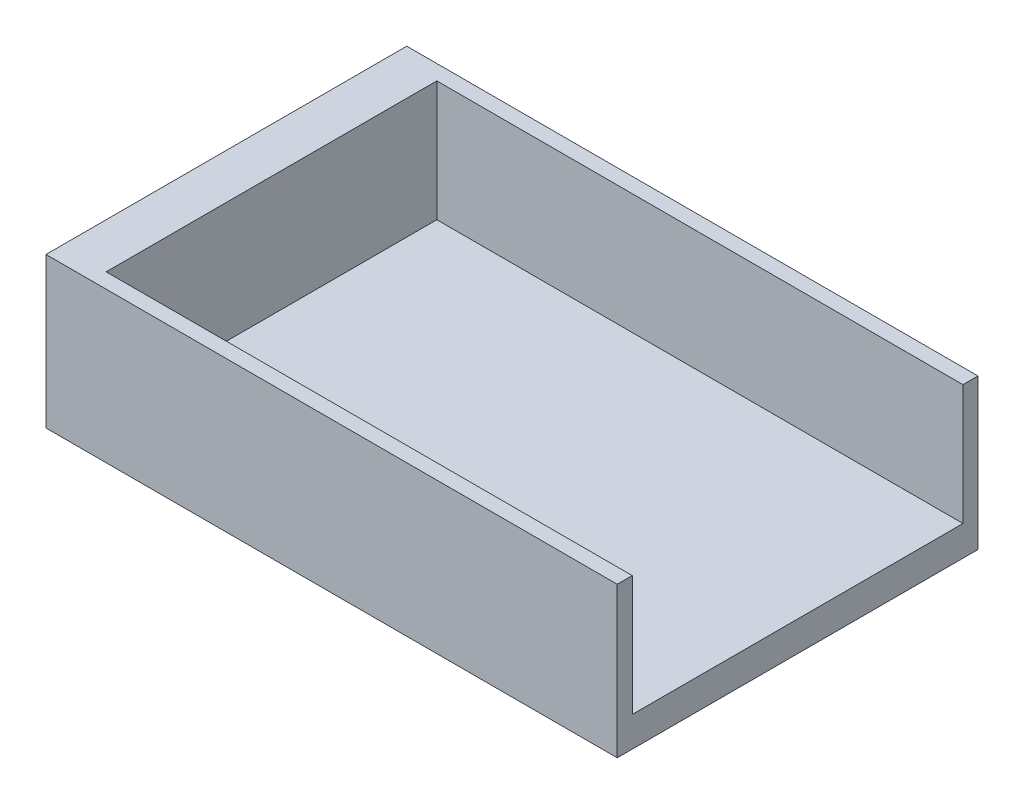
ISO-10303-21;
HEADER;
FILE_DESCRIPTION(('STEP AP214'),'2;1');
FILE_NAME('part.step','',(''),(''),'','','');
FILE_SCHEMA(('AUTOMOTIVE_DESIGN { 1 0 10303 214 1 1 1 1 }'));
ENDSEC;
DATA;
#1=APPLICATION_CONTEXT('core data for automotive mechanical design processes');
#2=APPLICATION_PROTOCOL_DEFINITION('international standard','automotive_design',2000,#1);
#3=PRODUCT_CONTEXT('',#1,'mechanical');
#4=PRODUCT('Part','Part','',(#3));
#5=PRODUCT_RELATED_PRODUCT_CATEGORY('part','',(#4));
#6=PRODUCT_DEFINITION_FORMATION('','',#4);
#7=PRODUCT_DEFINITION_CONTEXT('part definition',#1,'design');
#8=PRODUCT_DEFINITION('design','',#6,#7);
#9=PRODUCT_DEFINITION_SHAPE('','',#8);
#10=(LENGTH_UNIT() NAMED_UNIT(*) SI_UNIT(.MILLI.,.METRE.));
#11=(NAMED_UNIT(*) PLANE_ANGLE_UNIT() SI_UNIT($,.RADIAN.));
#12=(NAMED_UNIT(*) SI_UNIT($,.STERADIAN.) SOLID_ANGLE_UNIT());
#13=UNCERTAINTY_MEASURE_WITH_UNIT(LENGTH_MEASURE(1.E-05),#10,'distance_accuracy_value','');
#14=(GEOMETRIC_REPRESENTATION_CONTEXT(3) GLOBAL_UNCERTAINTY_ASSIGNED_CONTEXT((#13)) GLOBAL_UNIT_ASSIGNED_CONTEXT((#10,
#11,#12)) REPRESENTATION_CONTEXT('',''));
#15=CARTESIAN_POINT('',(0.,0.,0.));
#16=DIRECTION('',(0.,0.,1.));
#17=DIRECTION('',(1.,0.,0.));
#18=AXIS2_PLACEMENT_3D('',#15,#16,#17);
#19=CARTESIAN_POINT('',(0.,2.,0.));
#20=DIRECTION('',(0.,-1.,0.));
#21=DIRECTION('',(0.,0.,-1.));
#22=AXIS2_PLACEMENT_3D('',#19,#20,#21);
#23=PLANE('',#22);
#24=DIRECTION('',(0.,0.,1.));
#25=VECTOR('',#24,1.);
#26=CARTESIAN_POINT('',(38.,2.,0.));
#27=LINE('',#26,#25);
#28=CARTESIAN_POINT('',(38.,2.,-23.));
#29=VERTEX_POINT('',#28);
#30=CARTESIAN_POINT('',(38.,2.,-1.));
#31=VERTEX_POINT('',#30);
#32=EDGE_CURVE('E185',#29,#31,#27,.T.);
#33=ORIENTED_EDGE('',*,*,#32,.F.);
#34=DIRECTION('',(-1.,0.,0.));
#35=VECTOR('',#34,1.);
#36=CARTESIAN_POINT('',(3.,2.,-23.));
#37=LINE('',#36,#35);
#38=CARTESIAN_POINT('',(3.,2.,-23.));
#39=VERTEX_POINT('',#38);
#40=EDGE_CURVE('E235',#29,#39,#37,.T.);
#41=ORIENTED_EDGE('',*,*,#40,.T.);
#42=DIRECTION('',(0.,0.,1.));
#43=VECTOR('',#42,1.);
#44=CARTESIAN_POINT('',(3.,2.,-1.));
#45=LINE('',#44,#43);
#46=CARTESIAN_POINT('',(3.,2.,-1.));
#47=VERTEX_POINT('',#46);
#48=EDGE_CURVE('E222',#39,#47,#45,.T.);
#49=ORIENTED_EDGE('',*,*,#48,.T.);
#50=DIRECTION('',(1.,0.,0.));
#51=VECTOR('',#50,1.);
#52=CARTESIAN_POINT('',(3.,2.,-1.));
#53=LINE('',#52,#51);
#54=CARTESIAN_POINT('',(4.,2.,-1.));
#55=VERTEX_POINT('',#54);
#56=EDGE_CURVE('E247',#47,#55,#53,.T.);
#57=ORIENTED_EDGE('',*,*,#56,.T.);
#58=DIRECTION('',(0.,0.,1.));
#59=VECTOR('',#58,1.);
#60=CARTESIAN_POINT('',(4.,2.,-1.));
#61=LINE('',#60,#59);
#62=CARTESIAN_POINT('',(4.,2.,-4.));
#63=VERTEX_POINT('',#62);
#64=EDGE_CURVE('E192',#63,#55,#61,.T.);
#65=ORIENTED_EDGE('',*,*,#64,.F.);
#66=DIRECTION('',(-1.,0.,0.));
#67=VECTOR('',#66,1.);
#68=CARTESIAN_POINT('',(4.,2.,-4.));
#69=LINE('',#68,#67);
#70=CARTESIAN_POINT('',(8.,2.,-4.));
#71=VERTEX_POINT('',#70);
#72=EDGE_CURVE('E198',#71,#63,#69,.T.);
#73=ORIENTED_EDGE('',*,*,#72,.F.);
#74=DIRECTION('',(0.,0.,-1.));
#75=VECTOR('',#74,1.);
#76=CARTESIAN_POINT('',(8.,2.,-1.));
#77=LINE('',#76,#75);
#78=CARTESIAN_POINT('',(8.,2.,-1.));
#79=VERTEX_POINT('',#78);
#80=EDGE_CURVE('E68',#79,#71,#77,.T.);
#81=ORIENTED_EDGE('',*,*,#80,.F.);
#82=EDGE_CURVE('E246',#79,#31,#53,.T.);
#83=ORIENTED_EDGE('',*,*,#82,.T.);
#84=EDGE_LOOP('',(#33,#41,#49,#57,#65,#73,#81,#83));
#85=FACE_BOUND('',#84,.T.);
#86=ADVANCED_FACE('F45',(#85),#23,.F.);
#87=CARTESIAN_POINT('',(0.,2.,0.));
#88=DIRECTION('',(0.,0.,-1.));
#89=DIRECTION('',(-1.,0.,0.));
#90=AXIS2_PLACEMENT_3D('',#87,#88,#89);
#91=PLANE('',#90);
#92=DIRECTION('',(0.,-1.,0.));
#93=VECTOR('',#92,1.);
#94=CARTESIAN_POINT('',(38.,10.,0.));
#95=LINE('',#94,#93);
#96=CARTESIAN_POINT('',(38.,10.,0.));
#97=VERTEX_POINT('',#96);
#98=CARTESIAN_POINT('',(38.,0.,0.));
#99=VERTEX_POINT('',#98);
#100=EDGE_CURVE('E132',#97,#99,#95,.T.);
#101=ORIENTED_EDGE('',*,*,#100,.F.);
#102=DIRECTION('',(1.,0.,0.));
#103=VECTOR('',#102,1.);
#104=CARTESIAN_POINT('',(0.,10.,0.));
#105=LINE('',#104,#103);
#106=CARTESIAN_POINT('',(0.,10.,0.));
#107=VERTEX_POINT('',#106);
#108=EDGE_CURVE('E262',#107,#97,#105,.T.);
#109=ORIENTED_EDGE('',*,*,#108,.F.);
#110=DIRECTION('',(0.,-1.,0.));
#111=VECTOR('',#110,1.);
#112=CARTESIAN_POINT('',(0.,2.,0.));
#113=LINE('',#112,#111);
#114=CARTESIAN_POINT('',(0.,0.,0.));
#115=VERTEX_POINT('',#114);
#116=EDGE_CURVE('E54',#107,#115,#113,.T.);
#117=ORIENTED_EDGE('',*,*,#116,.T.);
#118=DIRECTION('',(1.,0.,0.));
#119=VECTOR('',#118,1.);
#120=CARTESIAN_POINT('',(0.,0.,0.));
#121=LINE('',#120,#119);
#122=EDGE_CURVE('E149',#115,#99,#121,.T.);
#123=ORIENTED_EDGE('',*,*,#122,.T.);
#124=EDGE_LOOP('',(#101,#109,#117,#123));
#125=FACE_BOUND('',#124,.T.);
#126=ADVANCED_FACE('F155',(#125),#91,.F.);
#127=CARTESIAN_POINT('',(0.,2.,-24.));
#128=DIRECTION('',(0.,0.,1.));
#129=DIRECTION('',(1.,0.,0.));
#130=AXIS2_PLACEMENT_3D('',#127,#128,#129);
#131=PLANE('',#130);
#132=DIRECTION('',(0.,1.,0.));
#133=VECTOR('',#132,1.);
#134=CARTESIAN_POINT('',(38.,10.,-24.));
#135=LINE('',#134,#133);
#136=CARTESIAN_POINT('',(38.,0.,-24.));
#137=VERTEX_POINT('',#136);
#138=CARTESIAN_POINT('',(38.,10.,-24.));
#139=VERTEX_POINT('',#138);
#140=EDGE_CURVE('E153',#137,#139,#135,.T.);
#141=ORIENTED_EDGE('',*,*,#140,.F.);
#142=DIRECTION('',(-1.,0.,0.));
#143=VECTOR('',#142,1.);
#144=CARTESIAN_POINT('',(0.,0.,-24.));
#145=LINE('',#144,#143);
#146=CARTESIAN_POINT('',(0.,0.,-24.));
#147=VERTEX_POINT('',#146);
#148=EDGE_CURVE('E151',#137,#147,#145,.T.);
#149=ORIENTED_EDGE('',*,*,#148,.T.);
#150=DIRECTION('',(0.,-1.,0.));
#151=VECTOR('',#150,1.);
#152=CARTESIAN_POINT('',(0.,2.,-24.));
#153=LINE('',#152,#151);
#154=CARTESIAN_POINT('',(0.,10.,-24.));
#155=VERTEX_POINT('',#154);
#156=EDGE_CURVE('E162',#155,#147,#153,.T.);
#157=ORIENTED_EDGE('',*,*,#156,.F.);
#158=DIRECTION('',(-1.,0.,0.));
#159=VECTOR('',#158,1.);
#160=CARTESIAN_POINT('',(0.,10.,-24.));
#161=LINE('',#160,#159);
#162=EDGE_CURVE('E164',#139,#155,#161,.T.);
#163=ORIENTED_EDGE('',*,*,#162,.F.);
#164=EDGE_LOOP('',(#141,#149,#157,#163));
#165=FACE_BOUND('',#164,.T.);
#166=ADVANCED_FACE('F178',(#165),#131,.F.);
#167=CARTESIAN_POINT('',(0.,0.,0.));
#168=DIRECTION('',(0.,-1.,0.));
#169=DIRECTION('',(0.,0.,-1.));
#170=AXIS2_PLACEMENT_3D('',#167,#168,#169);
#171=PLANE('',#170);
#172=DIRECTION('',(0.,0.,1.));
#173=VECTOR('',#172,1.);
#174=CARTESIAN_POINT('',(4.,0.,-1.));
#175=LINE('',#174,#173);
#176=CARTESIAN_POINT('',(4.,0.,-4.));
#177=VERTEX_POINT('',#176);
#178=CARTESIAN_POINT('',(4.,0.,-1.));
#179=VERTEX_POINT('',#178);
#180=EDGE_CURVE('E193',#177,#179,#175,.T.);
#181=ORIENTED_EDGE('',*,*,#180,.T.);
#182=DIRECTION('',(1.,0.,0.));
#183=VECTOR('',#182,1.);
#184=CARTESIAN_POINT('',(4.,0.,-1.));
#185=LINE('',#184,#183);
#186=CARTESIAN_POINT('',(8.,0.,-1.));
#187=VERTEX_POINT('',#186);
#188=EDGE_CURVE('E197',#179,#187,#185,.T.);
#189=ORIENTED_EDGE('',*,*,#188,.T.);
#190=DIRECTION('',(0.,0.,-1.));
#191=VECTOR('',#190,1.);
#192=CARTESIAN_POINT('',(8.,0.,-1.));
#193=LINE('',#192,#191);
#194=CARTESIAN_POINT('',(8.,0.,-4.));
#195=VERTEX_POINT('',#194);
#196=EDGE_CURVE('E202',#187,#195,#193,.T.);
#197=ORIENTED_EDGE('',*,*,#196,.T.);
#198=DIRECTION('',(-1.,0.,0.));
#199=VECTOR('',#198,1.);
#200=CARTESIAN_POINT('',(4.,0.,-4.));
#201=LINE('',#200,#199);
#202=EDGE_CURVE('E206',#195,#177,#201,.T.);
#203=ORIENTED_EDGE('',*,*,#202,.T.);
#204=EDGE_LOOP('',(#181,#189,#197,#203));
#205=FACE_BOUND('',#204,.T.);
#206=ORIENTED_EDGE('',*,*,#148,.F.);
#207=DIRECTION('',(0.,0.,-1.));
#208=VECTOR('',#207,1.);
#209=CARTESIAN_POINT('',(38.,0.,0.));
#210=LINE('',#209,#208);
#211=EDGE_CURVE('E135',#99,#137,#210,.T.);
#212=ORIENTED_EDGE('',*,*,#211,.F.);
#213=ORIENTED_EDGE('',*,*,#122,.F.);
#214=DIRECTION('',(0.,0.,1.));
#215=VECTOR('',#214,1.);
#216=CARTESIAN_POINT('',(0.,0.,0.));
#217=LINE('',#216,#215);
#218=EDGE_CURVE('E158',#147,#115,#217,.T.);
#219=ORIENTED_EDGE('',*,*,#218,.F.);
#220=EDGE_LOOP('',(#206,#212,#213,#219));
#221=FACE_BOUND('',#220,.T.);
#222=ADVANCED_FACE('F147',(#205,#221),#171,.T.);
#223=CARTESIAN_POINT('',(0.,10.,0.));
#224=DIRECTION('',(0.,1.,0.));
#225=DIRECTION('',(0.,0.,1.));
#226=AXIS2_PLACEMENT_3D('',#223,#224,#225);
#227=PLANE('',#226);
#228=ORIENTED_EDGE('',*,*,#108,.T.);
#229=DIRECTION('',(0.,0.,1.));
#230=VECTOR('',#229,1.);
#231=CARTESIAN_POINT('',(38.,10.,0.));
#232=LINE('',#231,#230);
#233=CARTESIAN_POINT('',(38.,10.,-1.));
#234=VERTEX_POINT('',#233);
#235=EDGE_CURVE('E138',#234,#97,#232,.T.);
#236=ORIENTED_EDGE('',*,*,#235,.F.);
#237=DIRECTION('',(1.,0.,0.));
#238=VECTOR('',#237,1.);
#239=CARTESIAN_POINT('',(3.,10.,-1.));
#240=LINE('',#239,#238);
#241=CARTESIAN_POINT('',(3.,10.,-1.));
#242=VERTEX_POINT('',#241);
#243=EDGE_CURVE('E234',#242,#234,#240,.T.);
#244=ORIENTED_EDGE('',*,*,#243,.F.);
#245=DIRECTION('',(0.,0.,1.));
#246=VECTOR('',#245,1.);
#247=CARTESIAN_POINT('',(3.,10.,-1.));
#248=LINE('',#247,#246);
#249=CARTESIAN_POINT('',(3.,10.,-23.));
#250=VERTEX_POINT('',#249);
#251=EDGE_CURVE('E231',#250,#242,#248,.T.);
#252=ORIENTED_EDGE('',*,*,#251,.F.);
#253=DIRECTION('',(-1.,0.,0.));
#254=VECTOR('',#253,1.);
#255=CARTESIAN_POINT('',(3.,10.,-23.));
#256=LINE('',#255,#254);
#257=CARTESIAN_POINT('',(38.,10.,-23.));
#258=VERTEX_POINT('',#257);
#259=EDGE_CURVE('E239',#258,#250,#256,.T.);
#260=ORIENTED_EDGE('',*,*,#259,.F.);
#261=EDGE_CURVE('E61',#139,#258,#232,.T.);
#262=ORIENTED_EDGE('',*,*,#261,.F.);
#263=ORIENTED_EDGE('',*,*,#162,.T.);
#264=DIRECTION('',(0.,0.,1.));
#265=VECTOR('',#264,1.);
#266=CARTESIAN_POINT('',(0.,10.,-24.));
#267=LINE('',#266,#265);
#268=EDGE_CURVE('E175',#155,#107,#267,.T.);
#269=ORIENTED_EDGE('',*,*,#268,.T.);
#270=EDGE_LOOP('',(#228,#236,#244,#252,#260,#262,#263,#269));
#271=FACE_BOUND('',#270,.T.);
#272=ADVANCED_FACE('F266',(#271),#227,.T.);
#273=CARTESIAN_POINT('',(3.,10.,-1.));
#274=DIRECTION('',(0.,0.,-1.));
#275=DIRECTION('',(-1.,0.,0.));
#276=AXIS2_PLACEMENT_3D('',#273,#274,#275);
#277=PLANE('',#276);
#278=ORIENTED_EDGE('',*,*,#243,.T.);
#279=DIRECTION('',(0.,-1.,0.));
#280=VECTOR('',#279,1.);
#281=CARTESIAN_POINT('',(38.,10.,-1.));
#282=LINE('',#281,#280);
#283=EDGE_CURVE('E188',#234,#31,#282,.T.);
#284=ORIENTED_EDGE('',*,*,#283,.T.);
#285=ORIENTED_EDGE('',*,*,#82,.F.);
#286=DIRECTION('',(0.,1.,0.));
#287=VECTOR('',#286,1.);
#288=CARTESIAN_POINT('',(8.,0.,-1.));
#289=LINE('',#288,#287);
#290=EDGE_CURVE('E226',#187,#79,#289,.T.);
#291=ORIENTED_EDGE('',*,*,#290,.F.);
#292=ORIENTED_EDGE('',*,*,#188,.F.);
#293=DIRECTION('',(0.,1.,0.));
#294=VECTOR('',#293,1.);
#295=CARTESIAN_POINT('',(4.,0.,-1.));
#296=LINE('',#295,#294);
#297=EDGE_CURVE('E210',#179,#55,#296,.T.);
#298=ORIENTED_EDGE('',*,*,#297,.T.);
#299=ORIENTED_EDGE('',*,*,#56,.F.);
#300=DIRECTION('',(0.,-1.,0.));
#301=VECTOR('',#300,1.);
#302=CARTESIAN_POINT('',(3.,10.,-1.));
#303=LINE('',#302,#301);
#304=EDGE_CURVE('E256',#242,#47,#303,.T.);
#305=ORIENTED_EDGE('',*,*,#304,.F.);
#306=EDGE_LOOP('',(#278,#284,#285,#291,#292,#298,#299,#305));
#307=FACE_BOUND('',#306,.T.);
#308=ADVANCED_FACE('F284',(#307),#277,.T.);
#309=CARTESIAN_POINT('',(3.,10.,-23.));
#310=DIRECTION('',(0.,0.,1.));
#311=DIRECTION('',(1.,0.,0.));
#312=AXIS2_PLACEMENT_3D('',#309,#310,#311);
#313=PLANE('',#312);
#314=ORIENTED_EDGE('',*,*,#40,.F.);
#315=DIRECTION('',(0.,1.,0.));
#316=VECTOR('',#315,1.);
#317=CARTESIAN_POINT('',(38.,10.,-23.));
#318=LINE('',#317,#316);
#319=EDGE_CURVE('E11',#29,#258,#318,.T.);
#320=ORIENTED_EDGE('',*,*,#319,.T.);
#321=ORIENTED_EDGE('',*,*,#259,.T.);
#322=DIRECTION('',(0.,-1.,0.));
#323=VECTOR('',#322,1.);
#324=CARTESIAN_POINT('',(3.,10.,-23.));
#325=LINE('',#324,#323);
#326=EDGE_CURVE('E242',#250,#39,#325,.T.);
#327=ORIENTED_EDGE('',*,*,#326,.T.);
#328=EDGE_LOOP('',(#314,#320,#321,#327));
#329=FACE_BOUND('',#328,.T.);
#330=ADVANCED_FACE('F273',(#329),#313,.T.);
#331=CARTESIAN_POINT('',(0.,2.,0.));
#332=DIRECTION('',(1.,0.,0.));
#333=DIRECTION('',(0.,0.,-1.));
#334=AXIS2_PLACEMENT_3D('',#331,#332,#333);
#335=PLANE('',#334);
#336=ORIENTED_EDGE('',*,*,#218,.T.);
#337=ORIENTED_EDGE('',*,*,#116,.F.);
#338=ORIENTED_EDGE('',*,*,#268,.F.);
#339=ORIENTED_EDGE('',*,*,#156,.T.);
#340=EDGE_LOOP('',(#336,#337,#338,#339));
#341=FACE_BOUND('',#340,.T.);
#342=ADVANCED_FACE('F47',(#341),#335,.F.);
#343=CARTESIAN_POINT('',(3.,10.,-1.));
#344=DIRECTION('',(1.,0.,0.));
#345=DIRECTION('',(0.,0.,-1.));
#346=AXIS2_PLACEMENT_3D('',#343,#344,#345);
#347=PLANE('',#346);
#348=ORIENTED_EDGE('',*,*,#48,.F.);
#349=ORIENTED_EDGE('',*,*,#326,.F.);
#350=ORIENTED_EDGE('',*,*,#251,.T.);
#351=ORIENTED_EDGE('',*,*,#304,.T.);
#352=EDGE_LOOP('',(#348,#349,#350,#351));
#353=FACE_BOUND('',#352,.T.);
#354=ADVANCED_FACE('F276',(#353),#347,.T.);
#355=CARTESIAN_POINT('',(4.,0.,-1.));
#356=DIRECTION('',(-1.,0.,0.));
#357=DIRECTION('',(0.,0.,1.));
#358=AXIS2_PLACEMENT_3D('',#355,#356,#357);
#359=PLANE('',#358);
#360=ORIENTED_EDGE('',*,*,#64,.T.);
#361=ORIENTED_EDGE('',*,*,#297,.F.);
#362=ORIENTED_EDGE('',*,*,#180,.F.);
#363=DIRECTION('',(0.,1.,0.));
#364=VECTOR('',#363,1.);
#365=CARTESIAN_POINT('',(4.,0.,-4.));
#366=LINE('',#365,#364);
#367=EDGE_CURVE('E219',#177,#63,#366,.T.);
#368=ORIENTED_EDGE('',*,*,#367,.T.);
#369=EDGE_LOOP('',(#360,#361,#362,#368));
#370=FACE_BOUND('',#369,.T.);
#371=ADVANCED_FACE('F289',(#370),#359,.F.);
#372=CARTESIAN_POINT('',(4.,0.,-4.));
#373=DIRECTION('',(0.,0.,-1.));
#374=DIRECTION('',(-1.,0.,0.));
#375=AXIS2_PLACEMENT_3D('',#372,#373,#374);
#376=PLANE('',#375);
#377=ORIENTED_EDGE('',*,*,#72,.T.);
#378=ORIENTED_EDGE('',*,*,#367,.F.);
#379=ORIENTED_EDGE('',*,*,#202,.F.);
#380=DIRECTION('',(0.,1.,0.));
#381=VECTOR('',#380,1.);
#382=CARTESIAN_POINT('',(8.,0.,-4.));
#383=LINE('',#382,#381);
#384=EDGE_CURVE('E223',#195,#71,#383,.T.);
#385=ORIENTED_EDGE('',*,*,#384,.T.);
#386=EDGE_LOOP('',(#377,#378,#379,#385));
#387=FACE_BOUND('',#386,.T.);
#388=ADVANCED_FACE('F292',(#387),#376,.F.);
#389=CARTESIAN_POINT('',(8.,0.,-1.));
#390=DIRECTION('',(1.,0.,0.));
#391=DIRECTION('',(0.,0.,-1.));
#392=AXIS2_PLACEMENT_3D('',#389,#390,#391);
#393=PLANE('',#392);
#394=ORIENTED_EDGE('',*,*,#80,.T.);
#395=ORIENTED_EDGE('',*,*,#384,.F.);
#396=ORIENTED_EDGE('',*,*,#196,.F.);
#397=ORIENTED_EDGE('',*,*,#290,.T.);
#398=EDGE_LOOP('',(#394,#395,#396,#397));
#399=FACE_BOUND('',#398,.T.);
#400=ADVANCED_FACE('F294',(#399),#393,.F.);
#401=CARTESIAN_POINT('',(38.,0.,0.));
#402=DIRECTION('',(1.,0.,0.));
#403=DIRECTION('',(0.,0.,-1.));
#404=AXIS2_PLACEMENT_3D('',#401,#402,#403);
#405=PLANE('',#404);
#406=ORIENTED_EDGE('',*,*,#235,.T.);
#407=ORIENTED_EDGE('',*,*,#100,.T.);
#408=ORIENTED_EDGE('',*,*,#211,.T.);
#409=ORIENTED_EDGE('',*,*,#140,.T.);
#410=ORIENTED_EDGE('',*,*,#261,.T.);
#411=ORIENTED_EDGE('',*,*,#319,.F.);
#412=ORIENTED_EDGE('',*,*,#32,.T.);
#413=ORIENTED_EDGE('',*,*,#283,.F.);
#414=EDGE_LOOP('',(#406,#407,#408,#409,#410,#411,#412,#413));
#415=FACE_BOUND('',#414,.T.);
#416=ADVANCED_FACE('F134',(#415),#405,.T.);
#417=CLOSED_SHELL('',(#86,#126,#166,#222,#272,#308,#330,#342,#354,#371,#388,#400,#416));
#418=MANIFOLD_SOLID_BREP('B2',#417);
#419=ADVANCED_BREP_SHAPE_REPRESENTATION('',(#18,#418),#14);
#420=SHAPE_DEFINITION_REPRESENTATION(#9,#419);
ENDSEC;
END-ISO-10303-21;
